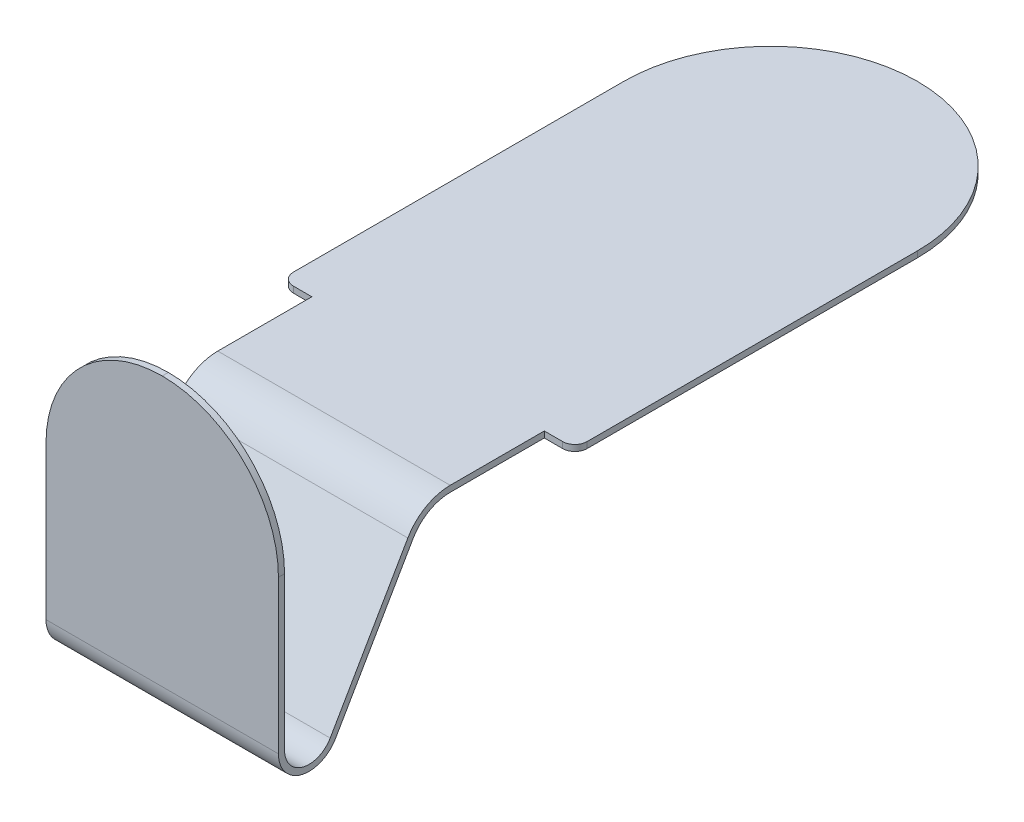
ISO-10303-21;
HEADER;
FILE_DESCRIPTION(('STEP AP214'),'2;1');
FILE_NAME('part.step','',(''),(''),'','','');
FILE_SCHEMA(('AUTOMOTIVE_DESIGN { 1 0 10303 214 1 1 1 1 }'));
ENDSEC;
DATA;
#1=APPLICATION_CONTEXT('core data for automotive mechanical design processes');
#2=APPLICATION_PROTOCOL_DEFINITION('international standard','automotive_design',2000,#1);
#3=PRODUCT_CONTEXT('',#1,'mechanical');
#4=PRODUCT('Part','Part','',(#3));
#5=PRODUCT_RELATED_PRODUCT_CATEGORY('part','',(#4));
#6=PRODUCT_DEFINITION_FORMATION('','',#4);
#7=PRODUCT_DEFINITION_CONTEXT('part definition',#1,'design');
#8=PRODUCT_DEFINITION('design','',#6,#7);
#9=PRODUCT_DEFINITION_SHAPE('','',#8);
#10=(LENGTH_UNIT() NAMED_UNIT(*) SI_UNIT(.MILLI.,.METRE.));
#11=(NAMED_UNIT(*) PLANE_ANGLE_UNIT() SI_UNIT($,.RADIAN.));
#12=(NAMED_UNIT(*) SI_UNIT($,.STERADIAN.) SOLID_ANGLE_UNIT());
#13=UNCERTAINTY_MEASURE_WITH_UNIT(LENGTH_MEASURE(1.E-05),#10,'distance_accuracy_value','');
#14=(GEOMETRIC_REPRESENTATION_CONTEXT(3) GLOBAL_UNCERTAINTY_ASSIGNED_CONTEXT((#13)) GLOBAL_UNIT_ASSIGNED_CONTEXT((#10,
#11,#12)) REPRESENTATION_CONTEXT('',''));
#15=CARTESIAN_POINT('',(0.,0.,0.));
#16=DIRECTION('',(0.,0.,1.));
#17=DIRECTION('',(1.,0.,0.));
#18=AXIS2_PLACEMENT_3D('',#15,#16,#17);
#19=CARTESIAN_POINT('',(-4.75,-5.00480947161671,-6.7707259421637));
#20=DIRECTION('',(-1.,0.,0.));
#21=DIRECTION('',(0.,0.,-1.));
#22=AXIS2_PLACEMENT_3D('',#19,#20,#21);
#23=PLANE('',#22);
#24=DIRECTION('',(0.,1.,0.));
#25=VECTOR('',#24,1.);
#26=CARTESIAN_POINT('',(-4.75,-5.00480947161671,-10.6160254037844));
#27=LINE('',#26,#25);
#28=CARTESIAN_POINT('',(-4.75,-5.25480947161671,-10.6160254037844));
#29=VERTEX_POINT('',#28);
#30=CARTESIAN_POINT('',(-4.75,-5.00480947161671,-10.6160254037844));
#31=VERTEX_POINT('',#30);
#32=EDGE_CURVE('E209',#29,#31,#27,.T.);
#33=ORIENTED_EDGE('',*,*,#32,.F.);
#34=DIRECTION('',(0.,0.,-1.));
#35=VECTOR('',#34,1.);
#36=CARTESIAN_POINT('',(-4.75,-5.25480947161671,-10.6160254037844));
#37=LINE('',#36,#35);
#38=CARTESIAN_POINT('',(-4.75,-5.25480947161671,-6.7707259421637));
#39=VERTEX_POINT('',#38);
#40=EDGE_CURVE('E249',#39,#29,#37,.T.);
#41=ORIENTED_EDGE('',*,*,#40,.F.);
#42=CARTESIAN_POINT('',(-4.75,-7.00480947161671,-6.77072594216369));
#43=DIRECTION('',(1.,0.,0.));
#44=DIRECTION('',(0.,0.,-1.));
#45=AXIS2_PLACEMENT_3D('',#42,#43,#44);
#46=CIRCLE('',#45,1.75);
#47=CARTESIAN_POINT('',(-4.75,-6.12980947161672,-5.25518148554092));
#48=VERTEX_POINT('',#47);
#49=EDGE_CURVE('E246',#48,#39,#46,.F.);
#50=ORIENTED_EDGE('',*,*,#49,.F.);
#51=DIRECTION('',(0.,0.866025403784439,-0.5));
#52=VECTOR('',#51,1.);
#53=CARTESIAN_POINT('',(-4.75,-11.625,-2.08253175473055));
#54=LINE('',#53,#52);
#55=CARTESIAN_POINT('',(-4.75,-11.625,-2.08253175473055));
#56=VERTEX_POINT('',#55);
#57=EDGE_CURVE('E240',#56,#48,#54,.T.);
#58=ORIENTED_EDGE('',*,*,#57,.F.);
#59=CARTESIAN_POINT('',(-4.75,-11.,-1.));
#60=DIRECTION('',(1.,0.,0.));
#61=DIRECTION('',(0.,0.,-1.));
#62=AXIS2_PLACEMENT_3D('',#59,#60,#61);
#63=CIRCLE('',#62,1.25);
#64=CARTESIAN_POINT('',(-4.75,-11.,0.25));
#65=VERTEX_POINT('',#64);
#66=EDGE_CURVE('E234',#65,#56,#63,.T.);
#67=ORIENTED_EDGE('',*,*,#66,.F.);
#68=DIRECTION('',(0.,1.,0.));
#69=VECTOR('',#68,1.);
#70=CARTESIAN_POINT('',(-4.75,-11.,0.25));
#71=LINE('',#70,#69);
#72=CARTESIAN_POINT('',(-4.75,-4.75,0.25));
#73=VERTEX_POINT('',#72);
#74=EDGE_CURVE('E253',#73,#65,#71,.F.);
#75=ORIENTED_EDGE('',*,*,#74,.F.);
#76=DIRECTION('',(0.,0.,-1.));
#77=VECTOR('',#76,1.);
#78=CARTESIAN_POINT('',(-4.75,-4.75,-6.7707259421637));
#79=LINE('',#78,#77);
#80=CARTESIAN_POINT('',(-4.75,-4.75,0.));
#81=VERTEX_POINT('',#80);
#82=EDGE_CURVE('E327',#73,#81,#79,.T.);
#83=ORIENTED_EDGE('',*,*,#82,.T.);
#84=DIRECTION('',(0.,-1.,0.));
#85=VECTOR('',#84,1.);
#86=CARTESIAN_POINT('',(-4.75,-11.,0.));
#87=LINE('',#86,#85);
#88=CARTESIAN_POINT('',(-4.75,-11.,0.));
#89=VERTEX_POINT('',#88);
#90=EDGE_CURVE('E198',#81,#89,#87,.T.);
#91=ORIENTED_EDGE('',*,*,#90,.T.);
#92=CARTESIAN_POINT('',(-4.75,-11.,-1.));
#93=DIRECTION('',(1.,0.,0.));
#94=DIRECTION('',(0.,0.,-1.));
#95=AXIS2_PLACEMENT_3D('',#92,#93,#94);
#96=CIRCLE('',#95,1.);
#97=CARTESIAN_POINT('',(-4.75,-11.5,-1.86602540378444));
#98=VERTEX_POINT('',#97);
#99=EDGE_CURVE('E273',#89,#98,#96,.T.);
#100=ORIENTED_EDGE('',*,*,#99,.T.);
#101=DIRECTION('',(0.,0.866025403784439,-0.5));
#102=VECTOR('',#101,1.);
#103=CARTESIAN_POINT('',(-4.75,-11.5,-1.86602540378444));
#104=LINE('',#103,#102);
#105=CARTESIAN_POINT('',(-4.75,-6.00480947161672,-5.03867513459481));
#106=VERTEX_POINT('',#105);
#107=EDGE_CURVE('E279',#98,#106,#104,.T.);
#108=ORIENTED_EDGE('',*,*,#107,.T.);
#109=CARTESIAN_POINT('',(-4.75,-7.00480947161671,-6.77072594216369));
#110=DIRECTION('',(-1.,0.,0.));
#111=DIRECTION('',(0.,0.,-1.));
#112=AXIS2_PLACEMENT_3D('',#109,#110,#111);
#113=CIRCLE('',#112,2.);
#114=CARTESIAN_POINT('',(-4.75,-5.00480947161671,-6.7707259421637));
#115=VERTEX_POINT('',#114);
#116=EDGE_CURVE('E291',#106,#115,#113,.T.);
#117=ORIENTED_EDGE('',*,*,#116,.T.);
#118=DIRECTION('',(0.,0.,-1.));
#119=VECTOR('',#118,1.);
#120=CARTESIAN_POINT('',(-4.75,-5.00480947161671,-6.7707259421637));
#121=LINE('',#120,#119);
#122=EDGE_CURVE('E285',#115,#31,#121,.T.);
#123=ORIENTED_EDGE('',*,*,#122,.T.);
#124=EDGE_LOOP('',(#33,#41,#50,#58,#67,#75,#83,#91,#100,#108,#117,#123));
#125=FACE_BOUND('',#124,.T.);
#126=ADVANCED_FACE('F49',(#125),#23,.T.);
#127=CARTESIAN_POINT('',(4.75,-11.,0.));
#128=DIRECTION('',(-1.,0.,0.));
#129=DIRECTION('',(0.,-1.,0.));
#130=AXIS2_PLACEMENT_3D('',#127,#128,#129);
#131=PLANE('',#130);
#132=DIRECTION('',(0.,1.,0.));
#133=VECTOR('',#132,1.);
#134=CARTESIAN_POINT('',(4.75,-11.,-10.6160254037844));
#135=LINE('',#134,#133);
#136=CARTESIAN_POINT('',(4.75,-5.00480947161671,-10.6160254037844));
#137=VERTEX_POINT('',#136);
#138=CARTESIAN_POINT('',(4.75,-5.25480947161671,-10.6160254037844));
#139=VERTEX_POINT('',#138);
#140=EDGE_CURVE('E190',#137,#139,#135,.F.);
#141=ORIENTED_EDGE('',*,*,#140,.F.);
#142=DIRECTION('',(0.,0.,-1.));
#143=VECTOR('',#142,1.);
#144=CARTESIAN_POINT('',(4.75,-5.00480947161671,-10.6160254037844));
#145=LINE('',#144,#143);
#146=CARTESIAN_POINT('',(4.75,-5.00480947161671,-6.7707259421637));
#147=VERTEX_POINT('',#146);
#148=EDGE_CURVE('E305',#147,#137,#145,.T.);
#149=ORIENTED_EDGE('',*,*,#148,.F.);
#150=CARTESIAN_POINT('',(4.75,-7.00480947161671,-6.77072594216369));
#151=DIRECTION('',(-1.,0.,0.));
#152=DIRECTION('',(0.,0.,-1.));
#153=AXIS2_PLACEMENT_3D('',#150,#151,#152);
#154=CIRCLE('',#153,2.);
#155=CARTESIAN_POINT('',(4.75,-6.00480947161672,-5.03867513459481));
#156=VERTEX_POINT('',#155);
#157=EDGE_CURVE('E289',#156,#147,#154,.T.);
#158=ORIENTED_EDGE('',*,*,#157,.F.);
#159=DIRECTION('',(0.,0.866025403784439,-0.5));
#160=VECTOR('',#159,1.);
#161=CARTESIAN_POINT('',(4.75,-11.5,-1.86602540378444));
#162=LINE('',#161,#160);
#163=CARTESIAN_POINT('',(4.75,-11.5,-1.86602540378444));
#164=VERTEX_POINT('',#163);
#165=EDGE_CURVE('E295',#164,#156,#162,.T.);
#166=ORIENTED_EDGE('',*,*,#165,.F.);
#167=CARTESIAN_POINT('',(4.75,-11.,-1.));
#168=DIRECTION('',(1.,0.,0.));
#169=DIRECTION('',(0.,0.,-1.));
#170=AXIS2_PLACEMENT_3D('',#167,#168,#169);
#171=CIRCLE('',#170,1.);
#172=CARTESIAN_POINT('',(4.75,-11.,0.));
#173=VERTEX_POINT('',#172);
#174=EDGE_CURVE('E283',#173,#164,#171,.T.);
#175=ORIENTED_EDGE('',*,*,#174,.F.);
#176=DIRECTION('',(0.,-1.,0.));
#177=VECTOR('',#176,1.);
#178=CARTESIAN_POINT('',(4.75,-11.,0.));
#179=LINE('',#178,#177);
#180=CARTESIAN_POINT('',(4.75,-4.75,0.));
#181=VERTEX_POINT('',#180);
#182=EDGE_CURVE('E277',#181,#173,#179,.T.);
#183=ORIENTED_EDGE('',*,*,#182,.F.);
#184=DIRECTION('',(0.,0.,-1.));
#185=VECTOR('',#184,1.);
#186=CARTESIAN_POINT('',(4.75,-4.75,0.));
#187=LINE('',#186,#185);
#188=CARTESIAN_POINT('',(4.75,-4.75,0.25));
#189=VERTEX_POINT('',#188);
#190=EDGE_CURVE('E337',#181,#189,#187,.F.);
#191=ORIENTED_EDGE('',*,*,#190,.T.);
#192=DIRECTION('',(0.,1.,0.));
#193=VECTOR('',#192,1.);
#194=CARTESIAN_POINT('',(4.75,-11.,0.25));
#195=LINE('',#194,#193);
#196=CARTESIAN_POINT('',(4.75,-11.,0.25));
#197=VERTEX_POINT('',#196);
#198=EDGE_CURVE('E250',#189,#197,#195,.F.);
#199=ORIENTED_EDGE('',*,*,#198,.T.);
#200=CARTESIAN_POINT('',(4.75,-11.,-1.));
#201=DIRECTION('',(1.,0.,0.));
#202=DIRECTION('',(0.,0.,-1.));
#203=AXIS2_PLACEMENT_3D('',#200,#201,#202);
#204=CIRCLE('',#203,1.25);
#205=CARTESIAN_POINT('',(4.75,-11.625,-2.08253175473055));
#206=VERTEX_POINT('',#205);
#207=EDGE_CURVE('E235',#197,#206,#204,.T.);
#208=ORIENTED_EDGE('',*,*,#207,.T.);
#209=DIRECTION('',(0.,0.866025403784439,-0.5));
#210=VECTOR('',#209,1.);
#211=CARTESIAN_POINT('',(4.75,-11.625,-2.08253175473055));
#212=LINE('',#211,#210);
#213=CARTESIAN_POINT('',(4.75,-6.12980947161672,-5.25518148554092));
#214=VERTEX_POINT('',#213);
#215=EDGE_CURVE('E241',#206,#214,#212,.T.);
#216=ORIENTED_EDGE('',*,*,#215,.T.);
#217=CARTESIAN_POINT('',(4.75,-7.00480947161671,-6.77072594216369));
#218=DIRECTION('',(1.,0.,0.));
#219=DIRECTION('',(0.,0.,-1.));
#220=AXIS2_PLACEMENT_3D('',#217,#218,#219);
#221=CIRCLE('',#220,1.75);
#222=CARTESIAN_POINT('',(4.75,-5.25480947161671,-6.7707259421637));
#223=VERTEX_POINT('',#222);
#224=EDGE_CURVE('E193',#214,#223,#221,.F.);
#225=ORIENTED_EDGE('',*,*,#224,.T.);
#226=DIRECTION('',(0.,0.,-1.));
#227=VECTOR('',#226,1.);
#228=CARTESIAN_POINT('',(4.75,-5.25480947161671,-10.6160254037844));
#229=LINE('',#228,#227);
#230=EDGE_CURVE('E186',#223,#139,#229,.T.);
#231=ORIENTED_EDGE('',*,*,#230,.T.);
#232=EDGE_LOOP('',(#141,#149,#158,#166,#175,#183,#191,#199,#208,#216,#225,#231));
#233=FACE_BOUND('',#232,.T.);
#234=ADVANCED_FACE('F188',(#233),#131,.F.);
#235=CARTESIAN_POINT('',(-4.75,-11.,0.25));
#236=DIRECTION('',(0.,0.,1.));
#237=DIRECTION('',(1.,0.,0.));
#238=AXIS2_PLACEMENT_3D('',#235,#236,#237);
#239=PLANE('',#238);
#240=CARTESIAN_POINT('',(0.,-4.75,0.25));
#241=DIRECTION('',(0.,0.,1.));
#242=DIRECTION('',(1.,0.,0.));
#243=AXIS2_PLACEMENT_3D('',#240,#241,#242);
#244=CIRCLE('',#243,4.75);
#245=CARTESIAN_POINT('',(0.,0.,0.25));
#246=VERTEX_POINT('',#245);
#247=EDGE_CURVE('E272',#189,#246,#244,.T.);
#248=ORIENTED_EDGE('',*,*,#247,.T.);
#249=CARTESIAN_POINT('',(0.,-4.75,0.25));
#250=DIRECTION('',(0.,0.,1.));
#251=DIRECTION('',(1.,0.,0.));
#252=AXIS2_PLACEMENT_3D('',#249,#250,#251);
#253=CIRCLE('',#252,4.75);
#254=EDGE_CURVE('E324',#246,#73,#253,.T.);
#255=ORIENTED_EDGE('',*,*,#254,.T.);
#256=ORIENTED_EDGE('',*,*,#74,.T.);
#257=DIRECTION('',(1.,0.,0.));
#258=VECTOR('',#257,1.);
#259=CARTESIAN_POINT('',(-4.75,-11.,0.25));
#260=LINE('',#259,#258);
#261=EDGE_CURVE('E230',#65,#197,#260,.T.);
#262=ORIENTED_EDGE('',*,*,#261,.T.);
#263=ORIENTED_EDGE('',*,*,#198,.F.);
#264=EDGE_LOOP('',(#248,#255,#256,#262,#263));
#265=FACE_BOUND('',#264,.T.);
#266=ADVANCED_FACE('F441',(#265),#239,.T.);
#267=CARTESIAN_POINT('',(-4.75,-11.,-1.));
#268=DIRECTION('',(1.,0.,0.));
#269=DIRECTION('',(0.,0.,-1.));
#270=AXIS2_PLACEMENT_3D('',#267,#268,#269);
#271=CYLINDRICAL_SURFACE('',#270,1.25);
#272=ORIENTED_EDGE('',*,*,#207,.F.);
#273=ORIENTED_EDGE('',*,*,#261,.F.);
#274=ORIENTED_EDGE('',*,*,#66,.T.);
#275=DIRECTION('',(1.,0.,0.));
#276=VECTOR('',#275,1.);
#277=CARTESIAN_POINT('',(-4.75,-11.625,-2.08253175473055));
#278=LINE('',#277,#276);
#279=EDGE_CURVE('E236',#56,#206,#278,.T.);
#280=ORIENTED_EDGE('',*,*,#279,.T.);
#281=EDGE_LOOP('',(#272,#273,#274,#280));
#282=FACE_BOUND('',#281,.T.);
#283=ADVANCED_FACE('F438',(#282),#271,.T.);
#284=CARTESIAN_POINT('',(-4.75,-11.625,-2.08253175473055));
#285=DIRECTION('',(0.,-0.5,-0.866025403784439));
#286=DIRECTION('',(0.,0.866025403784439,-0.5));
#287=AXIS2_PLACEMENT_3D('',#284,#285,#286);
#288=PLANE('',#287);
#289=ORIENTED_EDGE('',*,*,#215,.F.);
#290=ORIENTED_EDGE('',*,*,#279,.F.);
#291=ORIENTED_EDGE('',*,*,#57,.T.);
#292=DIRECTION('',(1.,0.,0.));
#293=VECTOR('',#292,1.);
#294=CARTESIAN_POINT('',(-4.75,-6.12980947161672,-5.25518148554092));
#295=LINE('',#294,#293);
#296=EDGE_CURVE('E242',#48,#214,#295,.T.);
#297=ORIENTED_EDGE('',*,*,#296,.T.);
#298=EDGE_LOOP('',(#289,#290,#291,#297));
#299=FACE_BOUND('',#298,.T.);
#300=ADVANCED_FACE('F435',(#299),#288,.T.);
#301=CARTESIAN_POINT('',(-4.75,-7.00480947161671,-6.77072594216369));
#302=DIRECTION('',(1.,0.,0.));
#303=DIRECTION('',(0.,0.,-1.));
#304=AXIS2_PLACEMENT_3D('',#301,#302,#303);
#305=CYLINDRICAL_SURFACE('',#304,1.75);
#306=ORIENTED_EDGE('',*,*,#224,.F.);
#307=ORIENTED_EDGE('',*,*,#296,.F.);
#308=ORIENTED_EDGE('',*,*,#49,.T.);
#309=DIRECTION('',(1.,0.,0.));
#310=VECTOR('',#309,1.);
#311=CARTESIAN_POINT('',(-4.75,-5.25480947161671,-6.7707259421637));
#312=LINE('',#311,#310);
#313=EDGE_CURVE('E197',#39,#223,#312,.T.);
#314=ORIENTED_EDGE('',*,*,#313,.T.);
#315=EDGE_LOOP('',(#306,#307,#308,#314));
#316=FACE_BOUND('',#315,.T.);
#317=ADVANCED_FACE('F427',(#316),#305,.F.);
#318=CARTESIAN_POINT('',(-4.75,-5.25480947161671,-10.6160254037844));
#319=DIRECTION('',(0.,-1.,0.));
#320=DIRECTION('',(0.,0.,-1.));
#321=AXIS2_PLACEMENT_3D('',#318,#319,#320);
#322=PLANE('',#321);
#323=DIRECTION('',(1.,0.,0.));
#324=VECTOR('',#323,1.);
#325=CARTESIAN_POINT('',(6.,-5.25480947161671,-10.6160254037844));
#326=LINE('',#325,#324);
#327=CARTESIAN_POINT('',(-5.5,-5.25480947161671,-10.6160254037844));
#328=VERTEX_POINT('',#327);
#329=EDGE_CURVE('E215',#328,#29,#326,.T.);
#330=ORIENTED_EDGE('',*,*,#329,.F.);
#331=CARTESIAN_POINT('',(-5.5,-5.25480947161671,-11.1160254037844));
#332=DIRECTION('',(0.,-1.,0.));
#333=DIRECTION('',(0.,0.,-1.));
#334=AXIS2_PLACEMENT_3D('',#331,#332,#333);
#335=CIRCLE('',#334,0.5);
#336=CARTESIAN_POINT('',(-6.,-5.25480947161671,-11.1160254037844));
#337=VERTEX_POINT('',#336);
#338=EDGE_CURVE('E384',#328,#337,#335,.T.);
#339=ORIENTED_EDGE('',*,*,#338,.T.);
#340=DIRECTION('',(0.,0.,1.));
#341=VECTOR('',#340,1.);
#342=CARTESIAN_POINT('',(-6.,-5.25480947161671,-30.6160254037844));
#343=LINE('',#342,#341);
#344=CARTESIAN_POINT('',(-6.,-5.25480947161671,-24.6160254037844));
#345=VERTEX_POINT('',#344);
#346=EDGE_CURVE('E216',#345,#337,#343,.T.);
#347=ORIENTED_EDGE('',*,*,#346,.F.);
#348=CARTESIAN_POINT('',(0.,-5.25480947161671,-24.6160254037844));
#349=DIRECTION('',(0.,-1.,0.));
#350=DIRECTION('',(0.,0.,-1.));
#351=AXIS2_PLACEMENT_3D('',#348,#349,#350);
#352=CIRCLE('',#351,6.);
#353=CARTESIAN_POINT('',(0.,-5.25480947161671,-30.6160254037844));
#354=VERTEX_POINT('',#353);
#355=EDGE_CURVE('E357',#345,#354,#352,.T.);
#356=ORIENTED_EDGE('',*,*,#355,.T.);
#357=CARTESIAN_POINT('',(0.,-5.25480947161671,-24.6160254037844));
#358=DIRECTION('',(0.,-1.,0.));
#359=DIRECTION('',(0.,0.,-1.));
#360=AXIS2_PLACEMENT_3D('',#357,#358,#359);
#361=CIRCLE('',#360,6.);
#362=CARTESIAN_POINT('',(6.,-5.25480947161671,-24.6160254037844));
#363=VERTEX_POINT('',#362);
#364=EDGE_CURVE('E353',#354,#363,#361,.T.);
#365=ORIENTED_EDGE('',*,*,#364,.T.);
#366=DIRECTION('',(0.,0.,-1.));
#367=VECTOR('',#366,1.);
#368=CARTESIAN_POINT('',(6.,-5.25480947161671,-30.6160254037844));
#369=LINE('',#368,#367);
#370=CARTESIAN_POINT('',(6.,-5.25480947161671,-11.1160254037844));
#371=VERTEX_POINT('',#370);
#372=EDGE_CURVE('E210',#371,#363,#369,.T.);
#373=ORIENTED_EDGE('',*,*,#372,.F.);
#374=CARTESIAN_POINT('',(5.5,-5.25480947161671,-11.1160254037844));
#375=DIRECTION('',(0.,-1.,0.));
#376=DIRECTION('',(0.,0.,-1.));
#377=AXIS2_PLACEMENT_3D('',#374,#375,#376);
#378=CIRCLE('',#377,0.5);
#379=CARTESIAN_POINT('',(5.5,-5.25480947161671,-10.6160254037844));
#380=VERTEX_POINT('',#379);
#381=EDGE_CURVE('E65',#371,#380,#378,.T.);
#382=ORIENTED_EDGE('',*,*,#381,.T.);
#383=EDGE_CURVE('E204',#139,#380,#326,.T.);
#384=ORIENTED_EDGE('',*,*,#383,.F.);
#385=ORIENTED_EDGE('',*,*,#230,.F.);
#386=ORIENTED_EDGE('',*,*,#313,.F.);
#387=ORIENTED_EDGE('',*,*,#40,.T.);
#388=EDGE_LOOP('',(#330,#339,#347,#356,#365,#373,#382,#384,#385,#386,#387));
#389=FACE_BOUND('',#388,.T.);
#390=ADVANCED_FACE('F213',(#389),#322,.T.);
#391=CARTESIAN_POINT('',(-4.75,-11.,0.));
#392=DIRECTION('',(0.,0.,1.));
#393=DIRECTION('',(1.,0.,0.));
#394=AXIS2_PLACEMENT_3D('',#391,#392,#393);
#395=PLANE('',#394);
#396=ORIENTED_EDGE('',*,*,#90,.F.);
#397=CARTESIAN_POINT('',(0.,-4.75,0.));
#398=DIRECTION('',(0.,0.,1.));
#399=DIRECTION('',(1.,0.,0.));
#400=AXIS2_PLACEMENT_3D('',#397,#398,#399);
#401=CIRCLE('',#400,4.75);
#402=CARTESIAN_POINT('',(0.,0.,0.));
#403=VERTEX_POINT('',#402);
#404=EDGE_CURVE('E334',#81,#403,#401,.F.);
#405=ORIENTED_EDGE('',*,*,#404,.T.);
#406=CARTESIAN_POINT('',(0.,-4.75,0.));
#407=DIRECTION('',(0.,0.,1.));
#408=DIRECTION('',(1.,0.,0.));
#409=AXIS2_PLACEMENT_3D('',#406,#407,#408);
#410=CIRCLE('',#409,4.75);
#411=EDGE_CURVE('E331',#403,#181,#410,.F.);
#412=ORIENTED_EDGE('',*,*,#411,.T.);
#413=ORIENTED_EDGE('',*,*,#182,.T.);
#414=DIRECTION('',(1.,0.,0.));
#415=VECTOR('',#414,1.);
#416=CARTESIAN_POINT('',(-4.75,-11.,0.));
#417=LINE('',#416,#415);
#418=EDGE_CURVE('E278',#89,#173,#417,.T.);
#419=ORIENTED_EDGE('',*,*,#418,.F.);
#420=EDGE_LOOP('',(#396,#405,#412,#413,#419));
#421=FACE_BOUND('',#420,.T.);
#422=ADVANCED_FACE('F451',(#421),#395,.F.);
#423=CARTESIAN_POINT('',(-4.75,-11.,-1.));
#424=DIRECTION('',(1.,0.,0.));
#425=DIRECTION('',(0.,0.,-1.));
#426=AXIS2_PLACEMENT_3D('',#423,#424,#425);
#427=CYLINDRICAL_SURFACE('',#426,1.);
#428=ORIENTED_EDGE('',*,*,#174,.T.);
#429=DIRECTION('',(1.,0.,0.));
#430=VECTOR('',#429,1.);
#431=CARTESIAN_POINT('',(-4.75,-11.5,-1.86602540378444));
#432=LINE('',#431,#430);
#433=EDGE_CURVE('E284',#98,#164,#432,.T.);
#434=ORIENTED_EDGE('',*,*,#433,.F.);
#435=ORIENTED_EDGE('',*,*,#99,.F.);
#436=ORIENTED_EDGE('',*,*,#418,.T.);
#437=EDGE_LOOP('',(#428,#434,#435,#436));
#438=FACE_BOUND('',#437,.T.);
#439=ADVANCED_FACE('F461',(#438),#427,.F.);
#440=CARTESIAN_POINT('',(-4.75,-11.5,-1.86602540378444));
#441=DIRECTION('',(0.,-0.5,-0.866025403784439));
#442=DIRECTION('',(0.,0.866025403784439,-0.5));
#443=AXIS2_PLACEMENT_3D('',#440,#441,#442);
#444=PLANE('',#443);
#445=ORIENTED_EDGE('',*,*,#165,.T.);
#446=DIRECTION('',(1.,0.,0.));
#447=VECTOR('',#446,1.);
#448=CARTESIAN_POINT('',(-4.75,-6.00480947161672,-5.03867513459481));
#449=LINE('',#448,#447);
#450=EDGE_CURVE('E296',#106,#156,#449,.T.);
#451=ORIENTED_EDGE('',*,*,#450,.F.);
#452=ORIENTED_EDGE('',*,*,#107,.F.);
#453=ORIENTED_EDGE('',*,*,#433,.T.);
#454=EDGE_LOOP('',(#445,#451,#452,#453));
#455=FACE_BOUND('',#454,.T.);
#456=ADVANCED_FACE('F465',(#455),#444,.F.);
#457=CARTESIAN_POINT('',(-4.75,-7.00480947161671,-6.77072594216369));
#458=DIRECTION('',(1.,0.,0.));
#459=DIRECTION('',(0.,0.,-1.));
#460=AXIS2_PLACEMENT_3D('',#457,#458,#459);
#461=CYLINDRICAL_SURFACE('',#460,2.);
#462=ORIENTED_EDGE('',*,*,#157,.T.);
#463=DIRECTION('',(1.,0.,0.));
#464=VECTOR('',#463,1.);
#465=CARTESIAN_POINT('',(-4.75,-5.00480947161671,-6.7707259421637));
#466=LINE('',#465,#464);
#467=EDGE_CURVE('E290',#115,#147,#466,.T.);
#468=ORIENTED_EDGE('',*,*,#467,.F.);
#469=ORIENTED_EDGE('',*,*,#116,.F.);
#470=ORIENTED_EDGE('',*,*,#450,.T.);
#471=EDGE_LOOP('',(#462,#468,#469,#470));
#472=FACE_BOUND('',#471,.T.);
#473=ADVANCED_FACE('F468',(#472),#461,.T.);
#474=CARTESIAN_POINT('',(-4.75,-5.00480947161671,-10.6160254037844));
#475=DIRECTION('',(0.,-1.,0.));
#476=DIRECTION('',(0.,0.,-1.));
#477=AXIS2_PLACEMENT_3D('',#474,#475,#476);
#478=PLANE('',#477);
#479=DIRECTION('',(0.,0.,1.));
#480=VECTOR('',#479,1.);
#481=CARTESIAN_POINT('',(-6.,-5.00480947161671,-30.6160254037844));
#482=LINE('',#481,#480);
#483=CARTESIAN_POINT('',(-6.,-5.00480947161671,-24.6160254037844));
#484=VERTEX_POINT('',#483);
#485=CARTESIAN_POINT('',(-6.,-5.00480947161671,-11.1160254037844));
#486=VERTEX_POINT('',#485);
#487=EDGE_CURVE('E392',#484,#486,#482,.T.);
#488=ORIENTED_EDGE('',*,*,#487,.T.);
#489=CARTESIAN_POINT('',(-5.5,-5.00480947161671,-11.1160254037844));
#490=DIRECTION('',(0.,-1.,0.));
#491=DIRECTION('',(0.,0.,-1.));
#492=AXIS2_PLACEMENT_3D('',#489,#490,#491);
#493=CIRCLE('',#492,0.5);
#494=CARTESIAN_POINT('',(-5.5,-5.00480947161671,-10.6160254037844));
#495=VERTEX_POINT('',#494);
#496=EDGE_CURVE('E376',#486,#495,#493,.F.);
#497=ORIENTED_EDGE('',*,*,#496,.T.);
#498=DIRECTION('',(1.,0.,0.));
#499=VECTOR('',#498,1.);
#500=CARTESIAN_POINT('',(6.,-5.00480947161671,-10.6160254037844));
#501=LINE('',#500,#499);
#502=EDGE_CURVE('E221',#495,#31,#501,.T.);
#503=ORIENTED_EDGE('',*,*,#502,.T.);
#504=ORIENTED_EDGE('',*,*,#122,.F.);
#505=ORIENTED_EDGE('',*,*,#467,.T.);
#506=ORIENTED_EDGE('',*,*,#148,.T.);
#507=CARTESIAN_POINT('',(5.5,-5.00480947161671,-10.6160254037844));
#508=VERTEX_POINT('',#507);
#509=EDGE_CURVE('E207',#137,#508,#501,.T.);
#510=ORIENTED_EDGE('',*,*,#509,.T.);
#511=CARTESIAN_POINT('',(5.5,-5.00480947161671,-11.1160254037844));
#512=DIRECTION('',(0.,-1.,0.));
#513=DIRECTION('',(0.,0.,-1.));
#514=AXIS2_PLACEMENT_3D('',#511,#512,#513);
#515=CIRCLE('',#514,0.5);
#516=CARTESIAN_POINT('',(6.,-5.00480947161671,-11.1160254037844));
#517=VERTEX_POINT('',#516);
#518=EDGE_CURVE('E373',#508,#517,#515,.F.);
#519=ORIENTED_EDGE('',*,*,#518,.T.);
#520=DIRECTION('',(0.,0.,-1.));
#521=VECTOR('',#520,1.);
#522=CARTESIAN_POINT('',(6.,-5.00480947161671,-30.6160254037844));
#523=LINE('',#522,#521);
#524=CARTESIAN_POINT('',(6.,-5.00480947161671,-24.6160254037844));
#525=VERTEX_POINT('',#524);
#526=EDGE_CURVE('E369',#517,#525,#523,.T.);
#527=ORIENTED_EDGE('',*,*,#526,.T.);
#528=CARTESIAN_POINT('',(0.,-5.00480947161671,-24.6160254037844));
#529=DIRECTION('',(0.,-1.,0.));
#530=DIRECTION('',(0.,0.,-1.));
#531=AXIS2_PLACEMENT_3D('',#528,#529,#530);
#532=CIRCLE('',#531,6.);
#533=CARTESIAN_POINT('',(0.,-5.00480947161671,-30.6160254037844));
#534=VERTEX_POINT('',#533);
#535=EDGE_CURVE('E340',#525,#534,#532,.F.);
#536=ORIENTED_EDGE('',*,*,#535,.T.);
#537=CARTESIAN_POINT('',(0.,-5.00480947161671,-24.6160254037844));
#538=DIRECTION('',(0.,-1.,0.));
#539=DIRECTION('',(0.,0.,-1.));
#540=AXIS2_PLACEMENT_3D('',#537,#538,#539);
#541=CIRCLE('',#540,6.);
#542=EDGE_CURVE('E346',#534,#484,#541,.F.);
#543=ORIENTED_EDGE('',*,*,#542,.T.);
#544=EDGE_LOOP('',(#488,#497,#503,#504,#505,#506,#510,#519,#527,#536,#543));
#545=FACE_BOUND('',#544,.T.);
#546=ADVANCED_FACE('F390',(#545),#478,.F.);
#547=CARTESIAN_POINT('',(0.,-4.75,0.));
#548=DIRECTION('',(0.,0.,1.));
#549=DIRECTION('',(1.,0.,0.));
#550=AXIS2_PLACEMENT_3D('',#547,#548,#549);
#551=CYLINDRICAL_SURFACE('',#550,4.75);
#552=ORIENTED_EDGE('',*,*,#190,.F.);
#553=ORIENTED_EDGE('',*,*,#411,.F.);
#554=DIRECTION('',(0.,0.,-1.));
#555=VECTOR('',#554,1.);
#556=CARTESIAN_POINT('',(0.,0.,0.));
#557=LINE('',#556,#555);
#558=EDGE_CURVE('E229',#246,#403,#557,.T.);
#559=ORIENTED_EDGE('',*,*,#558,.F.);
#560=ORIENTED_EDGE('',*,*,#247,.F.);
#561=EDGE_LOOP('',(#552,#553,#559,#560));
#562=FACE_BOUND('',#561,.T.);
#563=ADVANCED_FACE('F456',(#562),#551,.T.);
#564=CARTESIAN_POINT('',(0.,-4.75,0.));
#565=DIRECTION('',(0.,0.,-1.));
#566=DIRECTION('',(-1.,0.,0.));
#567=AXIS2_PLACEMENT_3D('',#564,#565,#566);
#568=CYLINDRICAL_SURFACE('',#567,4.75);
#569=ORIENTED_EDGE('',*,*,#404,.F.);
#570=ORIENTED_EDGE('',*,*,#82,.F.);
#571=ORIENTED_EDGE('',*,*,#254,.F.);
#572=ORIENTED_EDGE('',*,*,#558,.T.);
#573=EDGE_LOOP('',(#569,#570,#571,#572));
#574=FACE_BOUND('',#573,.T.);
#575=ADVANCED_FACE('F447',(#574),#568,.T.);
#576=CARTESIAN_POINT('',(6.,-28.5786170509979,-30.6160254037844));
#577=DIRECTION('',(1.,0.,0.));
#578=DIRECTION('',(0.,0.,-1.));
#579=AXIS2_PLACEMENT_3D('',#576,#577,#578);
#580=PLANE('',#579);
#581=ORIENTED_EDGE('',*,*,#526,.F.);
#582=DIRECTION('',(0.,1.,0.));
#583=VECTOR('',#582,1.);
#584=CARTESIAN_POINT('',(6.,-28.5786170509979,-11.1160254037844));
#585=LINE('',#584,#583);
#586=EDGE_CURVE('E11',#517,#371,#585,.F.);
#587=ORIENTED_EDGE('',*,*,#586,.T.);
#588=ORIENTED_EDGE('',*,*,#372,.T.);
#589=DIRECTION('',(0.,1.,0.));
#590=VECTOR('',#589,1.);
#591=CARTESIAN_POINT('',(6.,-28.5786170509979,-24.6160254037844));
#592=LINE('',#591,#590);
#593=EDGE_CURVE('E360',#363,#525,#592,.T.);
#594=ORIENTED_EDGE('',*,*,#593,.T.);
#595=EDGE_LOOP('',(#581,#587,#588,#594));
#596=FACE_BOUND('',#595,.T.);
#597=ADVANCED_FACE('F401',(#596),#580,.T.);
#598=CARTESIAN_POINT('',(6.,-28.5786170509979,-10.6160254037844));
#599=DIRECTION('',(0.,0.,1.));
#600=DIRECTION('',(1.,0.,0.));
#601=AXIS2_PLACEMENT_3D('',#598,#599,#600);
#602=PLANE('',#601);
#603=ORIENTED_EDGE('',*,*,#383,.T.);
#604=DIRECTION('',(0.,1.,0.));
#605=VECTOR('',#604,1.);
#606=CARTESIAN_POINT('',(5.5,-28.5786170509979,-10.6160254037844));
#607=LINE('',#606,#605);
#608=EDGE_CURVE('E58',#380,#508,#607,.T.);
#609=ORIENTED_EDGE('',*,*,#608,.T.);
#610=ORIENTED_EDGE('',*,*,#509,.F.);
#611=ORIENTED_EDGE('',*,*,#140,.T.);
#612=EDGE_LOOP('',(#603,#609,#610,#611));
#613=FACE_BOUND('',#612,.T.);
#614=ADVANCED_FACE('F202',(#613),#602,.T.);
#615=ORIENTED_EDGE('',*,*,#502,.F.);
#616=DIRECTION('',(0.,1.,0.));
#617=VECTOR('',#616,1.);
#618=CARTESIAN_POINT('',(-5.5,-28.5786170509979,-10.6160254037844));
#619=LINE('',#618,#617);
#620=EDGE_CURVE('E379',#495,#328,#619,.F.);
#621=ORIENTED_EDGE('',*,*,#620,.T.);
#622=ORIENTED_EDGE('',*,*,#329,.T.);
#623=ORIENTED_EDGE('',*,*,#32,.T.);
#624=EDGE_LOOP('',(#615,#621,#622,#623));
#625=FACE_BOUND('',#624,.T.);
#626=ADVANCED_FACE('F421',(#625),#602,.T.);
#627=CARTESIAN_POINT('',(-6.,-28.5786170509979,-30.6160254037844));
#628=DIRECTION('',(-1.,0.,0.));
#629=DIRECTION('',(0.,0.,1.));
#630=AXIS2_PLACEMENT_3D('',#627,#628,#629);
#631=PLANE('',#630);
#632=ORIENTED_EDGE('',*,*,#346,.T.);
#633=DIRECTION('',(0.,1.,0.));
#634=VECTOR('',#633,1.);
#635=CARTESIAN_POINT('',(-6.,-28.5786170509979,-11.1160254037844));
#636=LINE('',#635,#634);
#637=EDGE_CURVE('E364',#337,#486,#636,.T.);
#638=ORIENTED_EDGE('',*,*,#637,.T.);
#639=ORIENTED_EDGE('',*,*,#487,.F.);
#640=DIRECTION('',(0.,1.,0.));
#641=VECTOR('',#640,1.);
#642=CARTESIAN_POINT('',(-6.,-28.5786170509979,-24.6160254037844));
#643=LINE('',#642,#641);
#644=EDGE_CURVE('E349',#484,#345,#643,.F.);
#645=ORIENTED_EDGE('',*,*,#644,.T.);
#646=EDGE_LOOP('',(#632,#638,#639,#645));
#647=FACE_BOUND('',#646,.T.);
#648=ADVANCED_FACE('F411',(#647),#631,.T.);
#649=CARTESIAN_POINT('',(0.,-28.5786170509979,-24.6160254037844));
#650=DIRECTION('',(0.,1.,0.));
#651=DIRECTION('',(0.,0.,1.));
#652=AXIS2_PLACEMENT_3D('',#649,#650,#651);
#653=CYLINDRICAL_SURFACE('',#652,6.);
#654=ORIENTED_EDGE('',*,*,#593,.F.);
#655=ORIENTED_EDGE('',*,*,#364,.F.);
#656=DIRECTION('',(0.,1.,0.));
#657=VECTOR('',#656,1.);
#658=CARTESIAN_POINT('',(0.,-5.00480947161671,-30.6160254037844));
#659=LINE('',#658,#657);
#660=EDGE_CURVE('E365',#534,#354,#659,.F.);
#661=ORIENTED_EDGE('',*,*,#660,.F.);
#662=ORIENTED_EDGE('',*,*,#535,.F.);
#663=EDGE_LOOP('',(#654,#655,#661,#662));
#664=FACE_BOUND('',#663,.T.);
#665=ADVANCED_FACE('F404',(#664),#653,.T.);
#666=CARTESIAN_POINT('',(0.,-5.00480947161671,-24.6160254037844));
#667=DIRECTION('',(0.,1.,0.));
#668=DIRECTION('',(0.,0.,1.));
#669=AXIS2_PLACEMENT_3D('',#666,#667,#668);
#670=CYLINDRICAL_SURFACE('',#669,6.);
#671=ORIENTED_EDGE('',*,*,#355,.F.);
#672=ORIENTED_EDGE('',*,*,#644,.F.);
#673=ORIENTED_EDGE('',*,*,#542,.F.);
#674=ORIENTED_EDGE('',*,*,#660,.T.);
#675=EDGE_LOOP('',(#671,#672,#673,#674));
#676=FACE_BOUND('',#675,.T.);
#677=ADVANCED_FACE('F408',(#676),#670,.T.);
#678=CARTESIAN_POINT('',(-5.5,-28.5786170509979,-11.1160254037844));
#679=DIRECTION('',(0.,1.,0.));
#680=DIRECTION('',(0.,0.,1.));
#681=AXIS2_PLACEMENT_3D('',#678,#679,#680);
#682=CYLINDRICAL_SURFACE('',#681,0.5);
#683=ORIENTED_EDGE('',*,*,#338,.F.);
#684=ORIENTED_EDGE('',*,*,#620,.F.);
#685=ORIENTED_EDGE('',*,*,#496,.F.);
#686=ORIENTED_EDGE('',*,*,#637,.F.);
#687=EDGE_LOOP('',(#683,#684,#685,#686));
#688=FACE_BOUND('',#687,.T.);
#689=ADVANCED_FACE('F416',(#688),#682,.T.);
#690=CARTESIAN_POINT('',(5.5,-28.5786170509979,-11.1160254037844));
#691=DIRECTION('',(0.,1.,0.));
#692=DIRECTION('',(0.,0.,1.));
#693=AXIS2_PLACEMENT_3D('',#690,#691,#692);
#694=CYLINDRICAL_SURFACE('',#693,0.5);
#695=ORIENTED_EDGE('',*,*,#381,.F.);
#696=ORIENTED_EDGE('',*,*,#586,.F.);
#697=ORIENTED_EDGE('',*,*,#518,.F.);
#698=ORIENTED_EDGE('',*,*,#608,.F.);
#699=EDGE_LOOP('',(#695,#696,#697,#698));
#700=FACE_BOUND('',#699,.T.);
#701=ADVANCED_FACE('F51',(#700),#694,.T.);
#702=CLOSED_SHELL('',(#126,#234,#266,#283,#300,#317,#390,#422,#439,#456,#473,#546,#563,#575,
#597,#614,#626,#648,#665,#677,#689,#701));
#703=MANIFOLD_SOLID_BREP('B2',#702);
#704=ADVANCED_BREP_SHAPE_REPRESENTATION('',(#18,#703),#14);
#705=SHAPE_DEFINITION_REPRESENTATION(#9,#704);
ENDSEC;
END-ISO-10303-21;
